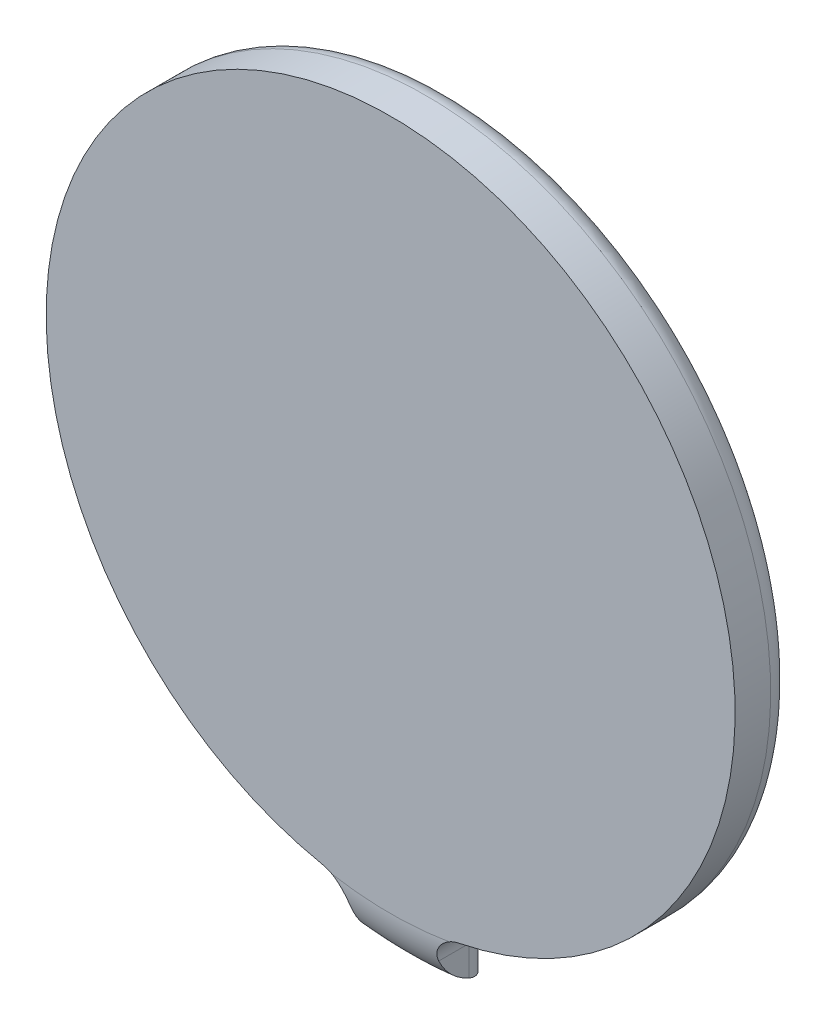
ISO-10303-21;
HEADER;
FILE_DESCRIPTION(('STEP AP214'),'2;1');
FILE_NAME('part.step','',(''),(''),'','','');
FILE_SCHEMA(('AUTOMOTIVE_DESIGN { 1 0 10303 214 1 1 1 1 }'));
ENDSEC;
DATA;
#1=APPLICATION_CONTEXT('core data for automotive mechanical design processes');
#2=APPLICATION_PROTOCOL_DEFINITION('international standard','automotive_design',2000,#1);
#3=PRODUCT_CONTEXT('',#1,'mechanical');
#4=PRODUCT('Part','Part','',(#3));
#5=PRODUCT_RELATED_PRODUCT_CATEGORY('part','',(#4));
#6=PRODUCT_DEFINITION_FORMATION('','',#4);
#7=PRODUCT_DEFINITION_CONTEXT('part definition',#1,'design');
#8=PRODUCT_DEFINITION('design','',#6,#7);
#9=PRODUCT_DEFINITION_SHAPE('','',#8);
#10=(LENGTH_UNIT() NAMED_UNIT(*) SI_UNIT(.MILLI.,.METRE.));
#11=(NAMED_UNIT(*) PLANE_ANGLE_UNIT() SI_UNIT($,.RADIAN.));
#12=(NAMED_UNIT(*) SI_UNIT($,.STERADIAN.) SOLID_ANGLE_UNIT());
#13=UNCERTAINTY_MEASURE_WITH_UNIT(LENGTH_MEASURE(1.E-05),#10,'distance_accuracy_value','');
#14=(GEOMETRIC_REPRESENTATION_CONTEXT(3) GLOBAL_UNCERTAINTY_ASSIGNED_CONTEXT((#13)) GLOBAL_UNIT_ASSIGNED_CONTEXT((#10,
#11,#12)) REPRESENTATION_CONTEXT('',''));
#15=CARTESIAN_POINT('',(0.,0.,0.));
#16=DIRECTION('',(0.,0.,1.));
#17=DIRECTION('',(1.,0.,0.));
#18=AXIS2_PLACEMENT_3D('',#15,#16,#17);
#19=CARTESIAN_POINT('',(1.06401134813455E-06,-1.62435410016243E-06,10.));
#20=DIRECTION('',(0.,0.,1.));
#21=DIRECTION('',(1.,0.,0.));
#22=AXIS2_PLACEMENT_3D('',#19,#20,#21);
#23=TOROIDAL_SURFACE('',#22,29.1827189766862,5.);
#24=CARTESIAN_POINT('',(5.72743974380435,-28.4621733237524,14.9977494937793));
#25=CARTESIAN_POINT('',(5.65452435426167,-28.476832506908,14.9977343908321));
#26=CARTESIAN_POINT('',(5.58223279373518,-28.4945743568944,14.9978512994538));
#27=CARTESIAN_POINT('',(5.43939919044139,-28.5360665243763,14.9982404246621));
#28=CARTESIAN_POINT('',(5.36885706045361,-28.5598165416617,14.9985126334895));
#29=CARTESIAN_POINT('',(5.23001285180405,-28.6131711879578,14.999103680927));
#30=CARTESIAN_POINT('',(5.16171090054791,-28.6427761492857,14.9994225221836));
#31=CARTESIAN_POINT('',(5.02785386968332,-28.7076103965319,14.9998943223226));
#32=CARTESIAN_POINT('',(4.96229876753665,-28.7428396362908,15.0000472825664));
#33=CARTESIAN_POINT('',(4.77037015301277,-28.8566710839978,14.999862806468));
#34=CARTESIAN_POINT('',(4.64869821550994,-28.9434305495226,14.9988824112752));
#35=CARTESIAN_POINT('',(4.421799447602,-29.1359952347135,14.9923773460635));
#36=CARTESIAN_POINT('',(4.31656504344077,-29.2417916342791,14.9868547762896));
#37=CARTESIAN_POINT('',(4.12678397197212,-29.4676859938194,14.9681018522867));
#38=CARTESIAN_POINT('',(4.04198763000879,-29.5875815596131,14.954971985052));
#39=CARTESIAN_POINT('',(3.89386807585266,-29.8385251158249,14.9181024425804));
#40=CARTESIAN_POINT('',(3.83054107791195,-29.9695711349499,14.8943646395828));
#41=CARTESIAN_POINT('',(3.72947979284891,-30.230646370297,14.8357404877748));
#42=CARTESIAN_POINT('',(3.69058644208153,-30.3603744574925,14.8014976770671));
#43=CARTESIAN_POINT('',(3.63334761322277,-30.6204668965051,14.72086074036));
#44=CARTESIAN_POINT('',(3.61497588473438,-30.7508302207487,14.6744822318345));
#45=CARTESIAN_POINT('',(3.60409760440967,-30.9096902680771,14.6099349669589));
#46=CARTESIAN_POINT('',(3.6025512595801,-30.9400228233211,14.5972400625739));
#47=CARTESIAN_POINT('',(3.60050369041556,-31.0003939565906,14.5712285266485));
#48=CARTESIAN_POINT('',(3.6000006710224,-31.0304329508905,14.5579130033318));
#49=CARTESIAN_POINT('',(3.60000107155852,-31.0603397720777,14.5442803381412));
#50=B_SPLINE_CURVE_WITH_KNOTS('',3,(#24,#25,#26,#27,#28,#29,#30,#31,#32,#33,#34,#35,#36,#37,#38,
#39,#40,#41,#42,#43,#44,#45,#46,#47,#48,#49),.UNSPECIFIED.,.F.,.F.,(4,2,2,2,2,2,2,2,2,2,2,2,4),
(0.,0.223050177425914,0.446089211904487,0.669140909358109,0.892190776287068,1.3381790248071,
1.78396116977377,2.22398491351687,2.66393102626924,3.08101200225106,3.49755885262959,
3.59630235013565,3.69487581646236),.UNSPECIFIED.);
#51=CARTESIAN_POINT('',(4.9275565203281,-28.7636989544465,15.));
#52=VERTEX_POINT('',#51);
#53=CARTESIAN_POINT('',(3.60000106401135,-31.0601397720777,14.5443715107841));
#54=VERTEX_POINT('',#53);
#55=EDGE_CURVE('E11',#52,#54,#50,.T.);
#56=ORIENTED_EDGE('',*,*,#55,.F.);
#57=CARTESIAN_POINT('',(1.06401134813455E-06,-1.62435410016243E-06,15.));
#58=DIRECTION('',(0.,0.,-1.));
#59=DIRECTION('',(-1.,0.,0.));
#60=AXIS2_PLACEMENT_3D('',#57,#58,#59);
#61=CIRCLE('',#60,29.1827189766862);
#62=CARTESIAN_POINT('',(-4.92755439230549,-28.7636989544465,15.));
#63=VERTEX_POINT('',#62);
#64=EDGE_CURVE('E127',#63,#52,#61,.F.);
#65=ORIENTED_EDGE('',*,*,#64,.F.);
#66=CARTESIAN_POINT('',(-3.59999894353582,-31.0603397720777,14.5442803381412));
#67=CARTESIAN_POINT('',(-3.59998444575881,-30.9968757878363,14.5732264098584));
#68=CARTESIAN_POINT('',(-3.60226940213302,-30.9327456586411,14.6007395356784));
#69=CARTESIAN_POINT('',(-3.61165085625501,-30.8036283489733,14.6528262252884));
#70=CARTESIAN_POINT('',(-3.61874881998883,-30.7386409132904,14.6773988907647));
#71=CARTESIAN_POINT('',(-3.63795757717695,-30.6084022387194,14.7234853896591));
#72=CARTESIAN_POINT('',(-3.65006230351932,-30.5431514134444,14.7450028830371));
#73=CARTESIAN_POINT('',(-3.67938708601792,-30.412899463917,14.785004172535));
#74=CARTESIAN_POINT('',(-3.69660640922361,-30.3478983052371,14.8034884027497));
#75=CARTESIAN_POINT('',(-3.75614050096227,-30.1538034672386,14.8545417443241));
#76=CARTESIAN_POINT('',(-3.80630306171519,-30.0258177602998,14.8826423357786));
#77=CARTESIAN_POINT('',(-3.92678491854651,-29.7778759234524,14.9281326102914));
#78=CARTESIAN_POINT('',(-3.99709282027738,-29.6579153016762,14.9455283306427));
#79=CARTESIAN_POINT('',(-4.15482629214307,-29.4318170272014,14.9717024228866));
#80=CARTESIAN_POINT('',(-4.24194797217504,-29.325482786106,14.9806191991187));
#81=CARTESIAN_POINT('',(-4.43184464078187,-29.1273516873463,14.9928872813536));
#82=CARTESIAN_POINT('',(-4.53463347004701,-29.0355678315183,14.9962336348558));
#83=CARTESIAN_POINT('',(-4.75872608553547,-28.8648160219328,14.9999569246587));
#84=CARTESIAN_POINT('',(-4.8807023285835,-28.7867282270911,15.0001755384882));
#85=CARTESIAN_POINT('',(-5.13563990940408,-28.6515159905706,14.9996421110835));
#86=CARTESIAN_POINT('',(-5.26858663106621,-28.594364190951,14.998891342432));
#87=CARTESIAN_POINT('',(-5.4579339476624,-28.5306634660948,14.9981876629065));
#88=CARTESIAN_POINT('',(-5.51126989704546,-28.5145776489435,14.9980278236432));
#89=CARTESIAN_POINT('',(-5.61876156305673,-28.4858198594248,14.9978076775179));
#90=CARTESIAN_POINT('',(-5.67291580388548,-28.4731423724336,14.9977472090551));
#91=CARTESIAN_POINT('',(-5.72743761578164,-28.4621733237524,14.9977494937793));
#92=B_SPLINE_CURVE_WITH_KNOTS('',3,(#66,#67,#68,#69,#70,#71,#72,#73,#74,#75,#76,#77,#78,#79,#80,
#81,#82,#83,#84,#85,#86,#87,#88,#89,#90,#91),.UNSPECIFIED.,.F.,.F.,(4,2,2,2,2,2,2,2,2,2,2,2,4),
(0.,0.209220863902826,0.418505482688915,0.627537233404117,0.836539043133054,1.25517288319699,
1.67357040682714,2.08501472931735,2.4968246599702,2.92941018071078,3.36142839019847,
3.52846877003367,3.69523723207078),.UNSPECIFIED.);
#93=CARTESIAN_POINT('',(-3.59999893598865,-31.0601397720777,14.5443715107841));
#94=VERTEX_POINT('',#93);
#95=EDGE_CURVE('E229',#94,#63,#92,.T.);
#96=ORIENTED_EDGE('',*,*,#95,.F.);
#97=CARTESIAN_POINT('',(-3.59999893598865,-26.7297537445027,14.484271778565));
#98=CARTESIAN_POINT('',(-3.59999893598865,-26.858056578042,14.5470002655548));
#99=CARTESIAN_POINT('',(-3.59999893598865,-26.9890188619382,14.6042806064454));
#100=CARTESIAN_POINT('',(-3.59999893598865,-27.2552951529068,14.7076063401975));
#101=CARTESIAN_POINT('',(-3.59999893598865,-27.3906089211916,14.753652348356));
#102=CARTESIAN_POINT('',(-3.59999893598865,-27.664549527534,14.8341525105312));
#103=CARTESIAN_POINT('',(-3.59999893598865,-27.8031742392639,14.8686139007514));
#104=CARTESIAN_POINT('',(-3.59999893598865,-28.0828307240921,14.9257476123564));
#105=CARTESIAN_POINT('',(-3.59999893598865,-28.2238624755718,14.9484200395654));
#106=CARTESIAN_POINT('',(-3.59999893598865,-28.5073699338428,14.9818177440214));
#107=CARTESIAN_POINT('',(-3.59999893598865,-28.6498459975083,14.9925399921287));
#108=CARTESIAN_POINT('',(-3.59999893598865,-28.935247886346,15.0019480734467));
#109=CARTESIAN_POINT('',(-3.59999893598865,-29.0781738581738,15.000629460498));
#110=CARTESIAN_POINT('',(-3.59999893598865,-29.3633245976379,14.9859501298111));
#111=CARTESIAN_POINT('',(-3.59999893598865,-29.5055497183478,14.9725962725611));
#112=CARTESIAN_POINT('',(-3.59999893598865,-29.7884192554774,14.9339322467623));
#113=CARTESIAN_POINT('',(-3.59999893598865,-29.9290630704984,14.9086176769889));
#114=CARTESIAN_POINT('',(-3.59999893598865,-30.2075774920563,14.846226722682));
#115=CARTESIAN_POINT('',(-3.59999893598865,-30.3454506005594,14.8091615080922));
#116=CARTESIAN_POINT('',(-3.59999893598865,-30.6176218192334,14.7234949575996));
#117=CARTESIAN_POINT('',(-3.59999893598865,-30.751918586623,14.6748893547848));
#118=CARTESIAN_POINT('',(-3.59999893598865,-31.0158838240633,14.5664935035577));
#119=CARTESIAN_POINT('',(-3.59999893598865,-31.1455533615922,14.5067058549106));
#120=CARTESIAN_POINT('',(-3.59999893598865,-31.3994032886358,14.3763268136733));
#121=CARTESIAN_POINT('',(-3.59999893598865,-31.5235816487335,14.3057314691046));
#122=CARTESIAN_POINT('',(-3.59999893598865,-31.7648618725127,14.1546402619869));
#123=CARTESIAN_POINT('',(-3.59999893598865,-31.8819972046623,14.0741978433725));
#124=CARTESIAN_POINT('',(-3.59999893598865,-32.109077503824,13.903655356653));
#125=CARTESIAN_POINT('',(-3.59999893598865,-32.2190199580159,13.8135519421974));
#126=CARTESIAN_POINT('',(-3.59999893598865,-32.4308385483615,13.6243687118066));
#127=CARTESIAN_POINT('',(-3.59999893598865,-32.5327167803282,13.5252912425894));
#128=CARTESIAN_POINT('',(-3.59999893598865,-32.7276902056947,13.3188418121353));
#129=CARTESIAN_POINT('',(-3.59999893598865,-32.8207854618144,13.2114699101393));
#130=CARTESIAN_POINT('',(-3.59999893598865,-32.9969652852379,12.989877631646));
#131=CARTESIAN_POINT('',(-3.59999893598865,-33.0801076319578,12.8757031901242));
#132=CARTESIAN_POINT('',(-3.59999893598865,-33.2364018747024,12.6407678680944));
#133=CARTESIAN_POINT('',(-3.59999893598865,-33.3095573318449,12.5200093569365));
#134=CARTESIAN_POINT('',(-3.59999893598865,-33.4453977853892,12.2726872773932));
#135=CARTESIAN_POINT('',(-3.59999893598865,-33.508079272309,12.1461217813114));
#136=CARTESIAN_POINT('',(-3.59999893598865,-33.6224579961781,11.888177501119));
#137=CARTESIAN_POINT('',(-3.59999893598865,-33.6741593449555,11.7568005404848));
#138=CARTESIAN_POINT('',(-3.59999893598865,-33.7659839871463,11.4908304265516));
#139=CARTESIAN_POINT('',(-3.59999893598865,-33.8061664277625,11.3562576908728));
#140=CARTESIAN_POINT('',(-3.59999893598865,-33.8750048518474,11.0842492241896));
#141=CARTESIAN_POINT('',(-3.59999893598865,-33.9036651609708,10.9468145880232));
#142=CARTESIAN_POINT('',(-3.59999893598865,-33.9492829282875,10.6699379128685));
#143=CARTESIAN_POINT('',(-3.59999893598865,-33.9662338659375,10.5304947994762));
#144=CARTESIAN_POINT('',(-3.59999893598865,-33.988278186477,10.2507264679218));
#145=CARTESIAN_POINT('',(-3.59999893598865,-33.9933759739013,10.1104015968558));
#146=CARTESIAN_POINT('',(-3.59999893598865,-33.9916914004408,9.83014778004418));
#147=CARTESIAN_POINT('',(-3.59999893598865,-33.9849364575298,9.690218668542));
#148=CARTESIAN_POINT('',(-3.59999893598865,-33.959653451819,9.41148052896702));
#149=CARTESIAN_POINT('',(-3.59999893598865,-33.9411297921343,9.27267110163992));
#150=CARTESIAN_POINT('',(-3.59999893598865,-33.8924677136672,8.99721163091675));
#151=CARTESIAN_POINT('',(-3.59999893598865,-33.8623379617628,8.86056005521836));
#152=CARTESIAN_POINT('',(-3.59999893598865,-33.7906952557413,8.59032784979729));
#153=CARTESIAN_POINT('',(-3.59999893598865,-33.7491868891583,8.45674600592003));
#154=CARTESIAN_POINT('',(-3.59999893598865,-33.6618656404782,8.21251191611961));
#155=CARTESIAN_POINT('',(-3.59999893598865,-33.6175331542934,8.10132759698105));
#156=CARTESIAN_POINT('',(-3.59999893598865,-33.5210802434081,7.88263529739623));
#157=CARTESIAN_POINT('',(-3.59999893598865,-33.4689743480039,7.77512090861954));
#158=CARTESIAN_POINT('',(-3.59999893598865,-33.4130643147077,7.66961397242508));
#159=B_SPLINE_CURVE_WITH_KNOTS('',3,(#97,#98,#99,#100,#101,#102,#103,#104,#105,#106,#107,#108,
#109,#110,#111,#112,#113,#114,#115,#116,#117,#118,#119,#120,#121,#122,#123,#124,#125,#126,#127,
#128,#129,#130,#131,#132,#133,#134,#135,#136,#137,#138,#139,#140,#141,#142,#143,#144,#145,#146,
#147,#148,#149,#150,#151,#152,#153,#154,#155,#156,#157,#158),.UNSPECIFIED.,.F.,.F.,(4,2,2,2,2,2,
2,2,2,2,2,2,2,2,2,2,2,2,2,2,2,2,2,2,2,2,2,2,2,2,4),(0.,0.428316284423876,0.856609104976208,
1.28463389787311,1.71265484852257,2.14078426956561,2.56907178632896,2.99711531931891,
3.42531648377317,3.85311182255659,4.28106558022587,4.70891996436122,5.13693117450988,
5.56271461980184,5.98864602622321,6.41446637126177,6.8402836752578,7.26349493763252,
7.68655489525423,8.10975632329295,8.53279899085442,8.95362883269052,9.37430053813265,
9.79520631263565,10.2159556569426,10.6357329981037,11.0553533773449,11.4746610095972,
11.8937998369305,12.2525871023709,12.6107119702999),.UNSPECIFIED.);
#160=CARTESIAN_POINT('',(-3.59999893598865,-33.5728347526865,12.));
#161=VERTEX_POINT('',#160);
#162=EDGE_CURVE('E71',#94,#161,#159,.T.);
#163=ORIENTED_EDGE('',*,*,#162,.T.);
#164=CARTESIAN_POINT('',(-3.59999892517784,-33.5727469610749,12.0002));
#165=CARTESIAN_POINT('',(-3.60000343776951,-33.594810556376,11.9499469267284));
#166=CARTESIAN_POINT('',(-3.59796028149307,-33.6162142676411,11.8994231909293));
#167=CARTESIAN_POINT('',(-3.58965599463252,-33.6576389100815,11.7981358889826));
#168=CARTESIAN_POINT('',(-3.58339331138171,-33.6776593292532,11.7473722413846));
#169=CARTESIAN_POINT('',(-3.55809170310904,-33.7355327907448,11.595215762932));
#170=CARTESIAN_POINT('',(-3.53253914959309,-33.7711917974325,11.49397169711));
#171=CARTESIAN_POINT('',(-3.46375504790968,-33.8363395943015,11.2952797209983));
#172=CARTESIAN_POINT('',(-3.42047723205476,-33.8658119287619,11.1978424822308));
#173=CARTESIAN_POINT('',(-3.31693852453738,-33.9186763525395,11.01075430238));
#174=CARTESIAN_POINT('',(-3.25669720660372,-33.9420753902187,10.921094542132));
#175=CARTESIAN_POINT('',(-3.12388425524803,-33.9825725973063,10.7567810861264));
#176=CARTESIAN_POINT('',(-3.05199911630376,-33.9999091900684,10.6816299442485));
#177=CARTESIAN_POINT('',(-2.89612182975859,-34.0305930720853,10.5440785402961));
#178=CARTESIAN_POINT('',(-2.81212465794194,-34.0439386987429,10.4816835957422));
#179=CARTESIAN_POINT('',(-2.6356775633925,-34.0674322344621,10.3725160540753));
#180=CARTESIAN_POINT('',(-2.54335161620754,-34.0776194300995,10.3255510503791));
#181=CARTESIAN_POINT('',(-2.35200754679306,-34.0958447377431,10.2476476880483));
#182=CARTESIAN_POINT('',(-2.25299404797024,-34.1038843158216,10.2166983826913));
#183=CARTESIAN_POINT('',(-2.08610819900358,-34.1158612293779,10.1795297734889));
#184=CARTESIAN_POINT('',(-2.01930830369566,-34.1202557172303,10.1684595675214));
#185=CARTESIAN_POINT('',(-1.88495287785334,-34.1284117785465,10.1536917176034));
#186=CARTESIAN_POINT('',(-1.81739849825113,-34.1321742044572,10.1499840696752));
#187=CARTESIAN_POINT('',(-1.74979893598865,-34.135651973816,10.1500000108108));
#188=B_SPLINE_CURVE_WITH_KNOTS('',3,(#164,#165,#166,#167,#168,#169,#170,#171,#172,#173,#174,
#175,#176,#177,#178,#179,#180,#181,#182,#183,#184,#185,#186,#187),.UNSPECIFIED.,.F.,.F.,(4,2,2,
2,2,2,2,2,2,2,2,4),(0.,0.164566657297011,0.329193903570246,0.658494637989713,0.988660470025734,
1.31844688277812,1.63321411991334,1.94811230388487,2.25891994202214,2.56951486175687,
2.77269554814567,2.97559997054066),.UNSPECIFIED.);
#189=CARTESIAN_POINT('',(-1.74999893598875,-34.135641721515,10.15));
#190=VERTEX_POINT('',#189);
#191=EDGE_CURVE('E190',#161,#190,#188,.T.);
#192=ORIENTED_EDGE('',*,*,#191,.T.);
#193=CARTESIAN_POINT('',(1.06401134813455E-06,-1.62435410016243E-06,10.15));
#194=DIRECTION('',(0.,0.,1.));
#195=DIRECTION('',(1.,0.,0.));
#196=AXIS2_PLACEMENT_3D('',#193,#194,#195);
#197=CIRCLE('',#196,34.1804684702083);
#198=CARTESIAN_POINT('',(1.75000106401135,-34.135641721515,10.15));
#199=VERTEX_POINT('',#198);
#200=EDGE_CURVE('E198',#199,#190,#197,.F.);
#201=ORIENTED_EDGE('',*,*,#200,.F.);
#202=CARTESIAN_POINT('',(1.74980106401135,-34.135651973816,10.1500000108108));
#203=CARTESIAN_POINT('',(1.80180100186951,-34.1329826007672,10.1499946660402));
#204=CARTESIAN_POINT('',(1.85376698347144,-34.1301383065574,10.1521826100539));
#205=CARTESIAN_POINT('',(1.95730712909934,-34.1240845974106,10.1609170359705));
#206=CARTESIAN_POINT('',(2.00888131366615,-34.1208752017578,10.1674632877618));
#207=CARTESIAN_POINT('',(2.16237028843179,-34.1106871715014,10.1935691679029));
#208=CARTESIAN_POINT('',(2.26322449638453,-34.1031400204594,10.2195961103646));
#209=CARTESIAN_POINT('',(2.45900473392788,-34.0860891069732,10.2881036552385));
#210=CARTESIAN_POINT('',(2.5539277884034,-34.0765843726968,10.3305924393143));
#211=CARTESIAN_POINT('',(2.73510122641695,-34.054853674457,10.4306758951634));
#212=CARTESIAN_POINT('',(2.82135306433652,-34.0426281679448,10.4882680278575));
#213=CARTESIAN_POINT('',(2.98260330811467,-34.0145551736584,10.6165990130429));
#214=CARTESIAN_POINT('',(3.05761481694959,-33.9987119583516,10.6873223394965));
#215=CARTESIAN_POINT('',(3.19441658028764,-33.9625050920314,10.839555160019));
#216=CARTESIAN_POINT('',(3.25620879737151,-33.9421421129533,10.9210630500631));
#217=CARTESIAN_POINT('',(3.36492754992057,-33.8962630092515,11.0918483202126));
#218=CARTESIAN_POINT('',(3.41188774190937,-33.8707587698682,11.1811075152805));
#219=CARTESIAN_POINT('',(3.49031752403112,-33.8142108702012,11.3645837801946));
#220=CARTESIAN_POINT('',(3.52178136102028,-33.7831651584213,11.4588026770216));
#221=CARTESIAN_POINT('',(3.56384456564172,-33.7230876968187,11.6280898520647));
#222=CARTESIAN_POINT('',(3.5775153249557,-33.6951222478363,11.7027981127294));
#223=CARTESIAN_POINT('',(3.5955991466468,-33.6361616617195,11.851954027532));
#224=CARTESIAN_POINT('',(3.60003246293241,-33.6051733091906,11.9264018937613));
#225=CARTESIAN_POINT('',(3.60000105320054,-33.5727469610749,12.0002));
#226=B_SPLINE_CURVE_WITH_KNOTS('',3,(#202,#203,#204,#205,#206,#207,#208,#209,#210,#211,#212,
#213,#214,#215,#216,#217,#218,#219,#220,#221,#222,#223,#224,#225),.UNSPECIFIED.,.F.,.F.,(4,2,2,
2,2,2,2,2,2,2,2,4),(0.,0.156108835053689,0.312209428470979,0.623897587638134,0.935740857384795,
1.24753173558833,1.55895627996233,1.87033455706001,2.18100109838381,2.49178289032828,
2.734012572694,2.97571058382496),.UNSPECIFIED.);
#227=CARTESIAN_POINT('',(3.60000106401135,-33.572834752686,12.));
#228=VERTEX_POINT('',#227);
#229=EDGE_CURVE('E230',#199,#228,#226,.T.);
#230=ORIENTED_EDGE('',*,*,#229,.T.);
#231=CARTESIAN_POINT('',(3.60000106401135,-33.4130643147077,7.66961397242508));
#232=CARTESIAN_POINT('',(3.60000106401135,-33.4786159100993,7.79330022250026));
#233=CARTESIAN_POINT('',(3.60000106401135,-33.538933711099,7.91975822532707));
#234=CARTESIAN_POINT('',(3.60000106401135,-33.6487227356979,8.17729315146078));
#235=CARTESIAN_POINT('',(3.60000106401135,-33.6981943344999,8.30836991480867));
#236=CARTESIAN_POINT('',(3.60000106401135,-33.785887236908,8.57413761207249));
#237=CARTESIAN_POINT('',(3.60000106401135,-33.8241160382513,8.70882607166908));
#238=CARTESIAN_POINT('',(3.60000106401135,-33.8890926191764,8.98094212782075));
#239=CARTESIAN_POINT('',(3.60000106401135,-33.9158405862842,9.11836967959759));
#240=CARTESIAN_POINT('',(3.60000106401135,-33.9576670773804,9.39503908645444));
#241=CARTESIAN_POINT('',(3.60000106401135,-33.9727414804994,9.53428156459771));
#242=CARTESIAN_POINT('',(3.60000106401135,-33.9910985163536,9.81359343932889));
#243=CARTESIAN_POINT('',(3.60000106401135,-33.9943767882829,9.95366312255593));
#244=CARTESIAN_POINT('',(3.60000106401135,-33.9891069015881,10.2334966618944));
#245=CARTESIAN_POINT('',(3.60000106401135,-33.9805657508671,10.3732606500584));
#246=CARTESIAN_POINT('',(3.60000106401135,-33.9517266961259,10.6516225484683));
#247=CARTESIAN_POINT('',(3.60000106401135,-33.9314244546208,10.7902200093572));
#248=CARTESIAN_POINT('',(3.60000106401135,-33.8792436708348,11.0650249971792));
#249=CARTESIAN_POINT('',(3.60000106401135,-33.8473807197684,11.2012354851349));
#250=CARTESIAN_POINT('',(3.60000106401135,-33.7722930885111,11.4705419652363));
#251=CARTESIAN_POINT('',(3.60000106401135,-33.7290642262964,11.6036367913205));
#252=CARTESIAN_POINT('',(3.60000106401135,-33.6315750917467,11.865691583157));
#253=CARTESIAN_POINT('',(3.60000106401135,-33.5773170855925,11.9946523920425));
#254=CARTESIAN_POINT('',(3.60000106401135,-33.4581361136978,12.2476057930624));
#255=CARTESIAN_POINT('',(3.60000106401135,-33.3932092215282,12.3715965351056));
#256=CARTESIAN_POINT('',(3.60000106401135,-33.253089053139,12.613836937917));
#257=CARTESIAN_POINT('',(3.60000106401135,-33.1778833152095,12.7320793900711));
#258=CARTESIAN_POINT('',(3.60000106401135,-33.017782343781,12.9618722094055));
#259=CARTESIAN_POINT('',(3.60000106401135,-32.9328837530557,13.0734202373644));
#260=CARTESIAN_POINT('',(3.60000106401135,-32.7540507273869,13.2889770778462));
#261=CARTESIAN_POINT('',(3.60000106401135,-32.6601183920116,13.3929876323764));
#262=CARTESIAN_POINT('',(3.60000106401135,-32.4638743777573,13.5927784228708));
#263=CARTESIAN_POINT('',(3.60000106401135,-32.3615626476288,13.6885586084896));
#264=CARTESIAN_POINT('',(3.60000106401135,-32.1487992302908,13.8716518810015));
#265=CARTESIAN_POINT('',(3.60000106401135,-32.0383121232525,13.9589238094147));
#266=CARTESIAN_POINT('',(3.60000106401135,-31.8104479412501,14.1238669005287));
#267=CARTESIAN_POINT('',(3.60000106401135,-31.6930732085621,14.2015412994747));
#268=CARTESIAN_POINT('',(3.60000106401135,-31.4521898840645,14.3468212889718));
#269=CARTESIAN_POINT('',(3.60000106401135,-31.3286790069714,14.4144230901297));
#270=CARTESIAN_POINT('',(3.60000106401135,-31.0764846704584,14.5390432502161));
#271=CARTESIAN_POINT('',(3.60000106401135,-30.9478030797361,14.5960653915224));
#272=CARTESIAN_POINT('',(3.60000106401135,-30.6852947343885,14.6995044569607));
#273=CARTESIAN_POINT('',(3.60000106401135,-30.5514403580554,14.7458512904398));
#274=CARTESIAN_POINT('',(3.60000106401135,-30.2803666131164,14.8271447582164));
#275=CARTESIAN_POINT('',(3.60000106401135,-30.1431484690774,14.8620954768583));
#276=CARTESIAN_POINT('',(3.60000106401135,-29.8661895174971,14.920406083004));
#277=CARTESIAN_POINT('',(3.60000106401135,-29.7264473147435,14.9437593431554));
#278=CARTESIAN_POINT('',(3.60000106401135,-29.4455506310585,14.9786884476889));
#279=CARTESIAN_POINT('',(3.60000106401135,-29.3043966785672,14.9902685437549));
#280=CARTESIAN_POINT('',(3.60000106401135,-29.0206628039562,15.0016341915146));
#281=CARTESIAN_POINT('',(3.60000106401135,-28.8780796774418,15.001339863909));
#282=CARTESIAN_POINT('',(3.60000106401135,-28.593494714976,14.9887710287496));
#283=CARTESIAN_POINT('',(3.60000106401135,-28.4514926864628,14.9765008786055));
#284=CARTESIAN_POINT('',(3.60000106401135,-28.1691123978818,14.9400896483309));
#285=CARTESIAN_POINT('',(3.60000106401135,-28.0287331513304,14.9159562154469));
#286=CARTESIAN_POINT('',(3.60000106401135,-27.7505451227974,14.8560035912029));
#287=CARTESIAN_POINT('',(3.60000106401135,-27.6127354024474,14.8201887577927));
#288=CARTESIAN_POINT('',(3.60000106401135,-27.3484462123517,14.7395097977228));
#289=CARTESIAN_POINT('',(3.60000106401135,-27.2217711100911,14.6952850687691));
#290=CARTESIAN_POINT('',(3.60000106401135,-26.9725429910945,14.5970460249746));
#291=CARTESIAN_POINT('',(3.60000106401135,-26.8499828787062,14.5430497091593));
#292=CARTESIAN_POINT('',(3.60000106401135,-26.7297537445027,14.484271778565));
#293=B_SPLINE_CURVE_WITH_KNOTS('',3,(#231,#232,#233,#234,#235,#236,#237,#238,#239,#240,#241,
#242,#243,#244,#245,#246,#247,#248,#249,#250,#251,#252,#253,#254,#255,#256,#257,#258,#259,#260,
#261,#262,#263,#264,#265,#266,#267,#268,#269,#270,#271,#272,#273,#274,#275,#276,#277,#278,#279,
#280,#281,#282,#283,#284,#285,#286,#287,#288,#289,#290,#291,#292),.UNSPECIFIED.,.F.,.F.,(4,2,2,
2,2,2,2,2,2,2,2,2,2,2,2,2,2,2,2,2,2,2,2,2,2,2,2,2,2,2,4),(0.,0.419823427949583,
0.839632330646015,1.25916062774716,1.67868207208127,2.09835154370198,2.5181761432323,
2.93775192943352,3.35748255359246,3.77664920437295,4.19597030154993,4.61520532689206,
5.03459498866645,5.45449768993926,5.8745462729002,6.29449746556403,6.71445122690287,
7.13634500007647,7.55809612200586,7.9800055116762,8.40176377089699,8.82621687864699,
9.25051769562651,9.67506070054192,10.0994503342411,10.5266953118305,10.9537848940258,
11.3805995283084,11.8072551137409,12.2093569273638,12.6107254815907),.UNSPECIFIED.);
#294=EDGE_CURVE('E56',#228,#54,#293,.T.);
#295=ORIENTED_EDGE('',*,*,#294,.T.);
#296=EDGE_LOOP('',(#56,#65,#96,#163,#192,#201,#230,#295));
#297=FACE_BOUND('',#296,.T.);
#298=ADVANCED_FACE('F43',(#297),#23,.T.);
#299=CARTESIAN_POINT('',(0.,0.,15.));
#300=DIRECTION('',(0.,0.,-1.));
#301=DIRECTION('',(-1.,0.,0.));
#302=AXIS2_PLACEMENT_3D('',#299,#300,#301);
#303=PLANE('',#302);
#304=CARTESIAN_POINT('',(1.06401134813455E-06,-1.62435410016243E-06,15.));
#305=DIRECTION('',(0.,0.,1.));
#306=DIRECTION('',(1.,0.,0.));
#307=AXIS2_PLACEMENT_3D('',#304,#305,#306);
#308=CIRCLE('',#307,29.0327189766862);
#309=CARTESIAN_POINT('',(5.72723974380433,-28.4622135602511,15.));
#310=VERTEX_POINT('',#309);
#311=CARTESIAN_POINT('',(-5.72723761578164,-28.4622135602511,15.));
#312=VERTEX_POINT('',#311);
#313=EDGE_CURVE('E160',#310,#312,#308,.T.);
#314=ORIENTED_EDGE('',*,*,#313,.T.);
#315=CARTESIAN_POINT('',(-6.24999893598865,-31.0601397720777,15.));
#316=DIRECTION('',(0.,0.,1.));
#317=DIRECTION('',(1.,0.,0.));
#318=AXIS2_PLACEMENT_3D('',#315,#316,#317);
#319=CIRCLE('',#318,2.65);
#320=EDGE_CURVE('E184',#63,#312,#319,.T.);
#321=ORIENTED_EDGE('',*,*,#320,.F.);
#322=ORIENTED_EDGE('',*,*,#64,.T.);
#323=CARTESIAN_POINT('',(6.25000106401135,-31.0601397720777,15.));
#324=DIRECTION('',(0.,0.,1.));
#325=DIRECTION('',(1.,0.,0.));
#326=AXIS2_PLACEMENT_3D('',#323,#324,#325);
#327=CIRCLE('',#326,2.65);
#328=EDGE_CURVE('E139',#310,#52,#327,.T.);
#329=ORIENTED_EDGE('',*,*,#328,.F.);
#330=EDGE_LOOP('',(#314,#321,#322,#329));
#331=FACE_BOUND('',#330,.T.);
#332=ADVANCED_FACE('F206',(#331),#303,.F.);
#333=CARTESIAN_POINT('',(1.06401134813455E-06,-1.62435410016243E-06,12.));
#334=DIRECTION('',(0.,0.,1.));
#335=DIRECTION('',(1.,0.,0.));
#336=AXIS2_PLACEMENT_3D('',#333,#334,#335);
#337=TOROIDAL_SURFACE('',#336,27.1827189766862,1.85);
#338=CARTESIAN_POINT('',(5.36229316177302,-26.648566959542,12.));
#339=DIRECTION('',(-0.98034951389681,-0.197268422719624,0.));
#340=DIRECTION('',(0.197268422719624,-0.98034951389681,0.));
#341=AXIS2_PLACEMENT_3D('',#338,#339,#340);
#342=CIRCLE('',#341,1.85);
#343=CARTESIAN_POINT('',(5.72723974380435,-28.4622135602511,12.));
#344=VERTEX_POINT('',#343);
#345=CARTESIAN_POINT('',(5.36229316177304,-26.648566959542,10.15));
#346=VERTEX_POINT('',#345);
#347=EDGE_CURVE('E140',#344,#346,#342,.F.);
#348=ORIENTED_EDGE('',*,*,#347,.T.);
#349=CARTESIAN_POINT('',(1.06401134813455E-06,-1.62435410016243E-06,10.15));
#350=DIRECTION('',(0.,0.,1.));
#351=DIRECTION('',(1.,0.,0.));
#352=AXIS2_PLACEMENT_3D('',#349,#350,#351);
#353=CIRCLE('',#352,27.1827189766862);
#354=CARTESIAN_POINT('',(-5.36229103375034,-26.648566959542,10.15));
#355=VERTEX_POINT('',#354);
#356=EDGE_CURVE('E170',#355,#346,#353,.F.);
#357=ORIENTED_EDGE('',*,*,#356,.F.);
#358=CARTESIAN_POINT('',(-5.36229103375034,-26.648566959542,12.));
#359=DIRECTION('',(0.98034951389681,-0.197268422719625,0.));
#360=DIRECTION('',(0.197268422719625,0.98034951389681,0.));
#361=AXIS2_PLACEMENT_3D('',#358,#359,#360);
#362=CIRCLE('',#361,1.85);
#363=CARTESIAN_POINT('',(-5.72723761578164,-28.4622135602511,12.));
#364=VERTEX_POINT('',#363);
#365=EDGE_CURVE('E169',#364,#355,#362,.T.);
#366=ORIENTED_EDGE('',*,*,#365,.F.);
#367=CARTESIAN_POINT('',(1.06401134813455E-06,-1.62435410016243E-06,12.));
#368=DIRECTION('',(0.,0.,1.));
#369=DIRECTION('',(1.,0.,0.));
#370=AXIS2_PLACEMENT_3D('',#367,#368,#369);
#371=CIRCLE('',#370,29.0327189766862);
#372=EDGE_CURVE('E146',#344,#364,#371,.T.);
#373=ORIENTED_EDGE('',*,*,#372,.F.);
#374=EDGE_LOOP('',(#348,#357,#366,#373));
#375=FACE_BOUND('',#374,.T.);
#376=ADVANCED_FACE('F208',(#375),#337,.T.);
#377=CARTESIAN_POINT('',(6.25000106401135,-31.0601397720777,12.));
#378=DIRECTION('',(0.,0.,1.));
#379=DIRECTION('',(1.,0.,0.));
#380=AXIS2_PLACEMENT_3D('',#377,#378,#379);
#381=TOROIDAL_SURFACE('',#380,4.5,1.85);
#382=CARTESIAN_POINT('',(1.75000106401135,-31.0601397720777,12.));
#383=DIRECTION('',(0.,1.,0.));
#384=DIRECTION('',(-1.,0.,0.));
#385=AXIS2_PLACEMENT_3D('',#382,#383,#384);
#386=CIRCLE('',#385,1.85);
#387=CARTESIAN_POINT('',(3.60000106401135,-31.0601397720777,12.));
#388=VERTEX_POINT('',#387);
#389=CARTESIAN_POINT('',(1.75000106401135,-31.0601397720777,10.15));
#390=VERTEX_POINT('',#389);
#391=EDGE_CURVE('E131',#388,#390,#386,.T.);
#392=ORIENTED_EDGE('',*,*,#391,.T.);
#393=CARTESIAN_POINT('',(6.25000106401135,-31.0601397720777,10.15));
#394=DIRECTION('',(0.,0.,1.));
#395=DIRECTION('',(1.,0.,0.));
#396=AXIS2_PLACEMENT_3D('',#393,#394,#395);
#397=CIRCLE('',#396,4.5);
#398=EDGE_CURVE('E174',#346,#390,#397,.T.);
#399=ORIENTED_EDGE('',*,*,#398,.F.);
#400=ORIENTED_EDGE('',*,*,#347,.F.);
#401=CARTESIAN_POINT('',(6.25000106401135,-31.0601397720777,12.));
#402=DIRECTION('',(0.,0.,1.));
#403=DIRECTION('',(1.,0.,0.));
#404=AXIS2_PLACEMENT_3D('',#401,#402,#403);
#405=CIRCLE('',#404,2.65);
#406=EDGE_CURVE('E128',#388,#344,#405,.F.);
#407=ORIENTED_EDGE('',*,*,#406,.F.);
#408=EDGE_LOOP('',(#392,#399,#400,#407));
#409=FACE_BOUND('',#408,.T.);
#410=ADVANCED_FACE('F143',(#409),#381,.T.);
#411=CARTESIAN_POINT('',(-6.24999893598865,-31.0601397720777,12.));
#412=DIRECTION('',(0.,0.,1.));
#413=DIRECTION('',(1.,0.,0.));
#414=AXIS2_PLACEMENT_3D('',#411,#412,#413);
#415=TOROIDAL_SURFACE('',#414,4.5,1.85);
#416=ORIENTED_EDGE('',*,*,#365,.T.);
#417=CARTESIAN_POINT('',(-6.24999893598865,-31.0601397720777,10.15));
#418=DIRECTION('',(0.,0.,1.));
#419=DIRECTION('',(1.,0.,0.));
#420=AXIS2_PLACEMENT_3D('',#417,#418,#419);
#421=CIRCLE('',#420,4.5);
#422=CARTESIAN_POINT('',(-1.74999893598865,-31.0601397720777,10.15));
#423=VERTEX_POINT('',#422);
#424=EDGE_CURVE('E173',#423,#355,#421,.T.);
#425=ORIENTED_EDGE('',*,*,#424,.F.);
#426=CARTESIAN_POINT('',(-1.74999893598865,-31.0601397720777,12.));
#427=DIRECTION('',(0.,1.,0.));
#428=DIRECTION('',(-1.,0.,0.));
#429=AXIS2_PLACEMENT_3D('',#426,#427,#428);
#430=CIRCLE('',#429,1.85);
#431=CARTESIAN_POINT('',(-3.59999893598865,-31.0601397720777,12.));
#432=VERTEX_POINT('',#431);
#433=EDGE_CURVE('E176',#432,#423,#430,.F.);
#434=ORIENTED_EDGE('',*,*,#433,.F.);
#435=CARTESIAN_POINT('',(-6.24999893598865,-31.0601397720777,12.));
#436=DIRECTION('',(0.,0.,1.));
#437=DIRECTION('',(1.,0.,0.));
#438=AXIS2_PLACEMENT_3D('',#435,#436,#437);
#439=CIRCLE('',#438,2.65);
#440=EDGE_CURVE('E163',#364,#432,#439,.F.);
#441=ORIENTED_EDGE('',*,*,#440,.F.);
#442=EDGE_LOOP('',(#416,#425,#434,#441));
#443=FACE_BOUND('',#442,.T.);
#444=ADVANCED_FACE('F204',(#443),#415,.T.);
#445=CARTESIAN_POINT('',(6.25000106401135,-31.0601397720777,9.99999999999999));
#446=DIRECTION('',(0.,0.,1.));
#447=DIRECTION('',(1.,0.,0.));
#448=AXIS2_PLACEMENT_3D('',#445,#446,#447);
#449=CYLINDRICAL_SURFACE('',#448,2.65);
#450=ORIENTED_EDGE('',*,*,#55,.T.);
#451=DIRECTION('',(0.,0.,1.));
#452=VECTOR('',#451,1.);
#453=CARTESIAN_POINT('',(3.60000106401135,-31.0601397720777,9.99999999999999));
#454=LINE('',#453,#452);
#455=EDGE_CURVE('E123',#388,#54,#454,.T.);
#456=ORIENTED_EDGE('',*,*,#455,.F.);
#457=ORIENTED_EDGE('',*,*,#406,.T.);
#458=DIRECTION('',(0.,0.,1.));
#459=VECTOR('',#458,1.);
#460=CARTESIAN_POINT('',(5.72723974380433,-28.4622135602511,9.99999999999999));
#461=LINE('',#460,#459);
#462=EDGE_CURVE('E157',#310,#344,#461,.F.);
#463=ORIENTED_EDGE('',*,*,#462,.F.);
#464=ORIENTED_EDGE('',*,*,#328,.T.);
#465=EDGE_LOOP('',(#450,#456,#457,#463,#464));
#466=FACE_BOUND('',#465,.T.);
#467=ADVANCED_FACE('F148',(#466),#449,.F.);
#468=CARTESIAN_POINT('',(-1.74999893598865,-28.9407788577361,12.));
#469=DIRECTION('',(0.,1.,0.));
#470=DIRECTION('',(-1.,0.,0.));
#471=AXIS2_PLACEMENT_3D('',#468,#469,#470);
#472=CYLINDRICAL_SURFACE('',#471,1.85);
#473=DIRECTION('',(0.,-1.,0.));
#474=VECTOR('',#473,1.);
#475=CARTESIAN_POINT('',(-3.59999893598865,-28.9407788577361,12.));
#476=LINE('',#475,#474);
#477=EDGE_CURVE('E150',#432,#161,#476,.T.);
#478=ORIENTED_EDGE('',*,*,#477,.F.);
#479=ORIENTED_EDGE('',*,*,#433,.T.);
#480=DIRECTION('',(0.,1.,0.));
#481=VECTOR('',#480,1.);
#482=CARTESIAN_POINT('',(-1.74999893598865,-1.62435410016243E-06,10.15));
#483=LINE('',#482,#481);
#484=EDGE_CURVE('E63',#190,#423,#483,.T.);
#485=ORIENTED_EDGE('',*,*,#484,.F.);
#486=ORIENTED_EDGE('',*,*,#191,.F.);
#487=EDGE_LOOP('',(#478,#479,#485,#486));
#488=FACE_BOUND('',#487,.T.);
#489=ADVANCED_FACE('F200',(#488),#472,.T.);
#490=CARTESIAN_POINT('',(1.75000106401135,-38.5624821422135,12.));
#491=DIRECTION('',(0.,-1.,0.));
#492=DIRECTION('',(1.,0.,0.));
#493=AXIS2_PLACEMENT_3D('',#490,#491,#492);
#494=CYLINDRICAL_SURFACE('',#493,1.85);
#495=DIRECTION('',(0.,1.,0.));
#496=VECTOR('',#495,1.);
#497=CARTESIAN_POINT('',(1.75000106401135,-1.62435410016243E-06,10.15));
#498=LINE('',#497,#496);
#499=EDGE_CURVE('E135',#390,#199,#498,.F.);
#500=ORIENTED_EDGE('',*,*,#499,.F.);
#501=ORIENTED_EDGE('',*,*,#391,.F.);
#502=DIRECTION('',(0.,1.,0.));
#503=VECTOR('',#502,1.);
#504=CARTESIAN_POINT('',(3.60000106401135,-38.5624821422135,12.));
#505=LINE('',#504,#503);
#506=EDGE_CURVE('E119',#228,#388,#505,.T.);
#507=ORIENTED_EDGE('',*,*,#506,.F.);
#508=ORIENTED_EDGE('',*,*,#229,.F.);
#509=EDGE_LOOP('',(#500,#501,#507,#508));
#510=FACE_BOUND('',#509,.T.);
#511=ADVANCED_FACE('F133',(#510),#494,.T.);
#512=CARTESIAN_POINT('',(1.06401134813455E-06,-1.62435410016243E-06,10.15));
#513=DIRECTION('',(0.,0.,1.));
#514=DIRECTION('',(1.,0.,0.));
#515=AXIS2_PLACEMENT_3D('',#512,#513,#514);
#516=PLANE('',#515);
#517=ORIENTED_EDGE('',*,*,#200,.T.);
#518=ORIENTED_EDGE('',*,*,#484,.T.);
#519=ORIENTED_EDGE('',*,*,#424,.T.);
#520=ORIENTED_EDGE('',*,*,#356,.T.);
#521=ORIENTED_EDGE('',*,*,#398,.T.);
#522=ORIENTED_EDGE('',*,*,#499,.T.);
#523=EDGE_LOOP('',(#517,#518,#519,#520,#521,#522));
#524=FACE_BOUND('',#523,.T.);
#525=ADVANCED_FACE('F252',(#524),#516,.F.);
#526=CARTESIAN_POINT('',(3.60000106401135,-38.5624821422135,9.99999999999999));
#527=DIRECTION('',(1.,0.,0.));
#528=DIRECTION('',(0.,1.,0.));
#529=AXIS2_PLACEMENT_3D('',#526,#527,#528);
#530=PLANE('',#529);
#531=ORIENTED_EDGE('',*,*,#506,.T.);
#532=ORIENTED_EDGE('',*,*,#455,.T.);
#533=ORIENTED_EDGE('',*,*,#294,.F.);
#534=EDGE_LOOP('',(#531,#532,#533));
#535=FACE_BOUND('',#534,.T.);
#536=ADVANCED_FACE('F121',(#535),#530,.T.);
#537=CARTESIAN_POINT('',(-6.24999893598865,-31.0601397720777,9.99999999999999));
#538=DIRECTION('',(0.,0.,1.));
#539=DIRECTION('',(1.,0.,0.));
#540=AXIS2_PLACEMENT_3D('',#537,#538,#539);
#541=CYLINDRICAL_SURFACE('',#540,2.65);
#542=ORIENTED_EDGE('',*,*,#95,.T.);
#543=ORIENTED_EDGE('',*,*,#320,.T.);
#544=DIRECTION('',(0.,0.,1.));
#545=VECTOR('',#544,1.);
#546=CARTESIAN_POINT('',(-5.72723761578164,-28.4622135602511,9.99999999999999));
#547=LINE('',#546,#545);
#548=EDGE_CURVE('E154',#364,#312,#547,.T.);
#549=ORIENTED_EDGE('',*,*,#548,.F.);
#550=ORIENTED_EDGE('',*,*,#440,.T.);
#551=DIRECTION('',(0.,0.,1.));
#552=VECTOR('',#551,1.);
#553=CARTESIAN_POINT('',(-3.59999893598865,-31.0601397720777,9.99999999999999));
#554=LINE('',#553,#552);
#555=EDGE_CURVE('E151',#94,#432,#554,.F.);
#556=ORIENTED_EDGE('',*,*,#555,.F.);
#557=EDGE_LOOP('',(#542,#543,#549,#550,#556));
#558=FACE_BOUND('',#557,.T.);
#559=ADVANCED_FACE('F225',(#558),#541,.F.);
#560=CARTESIAN_POINT('',(-3.59999893598865,-28.9407788577361,9.99999999999999));
#561=DIRECTION('',(-1.,0.,0.));
#562=DIRECTION('',(0.,-1.,0.));
#563=AXIS2_PLACEMENT_3D('',#560,#561,#562);
#564=PLANE('',#563);
#565=ORIENTED_EDGE('',*,*,#555,.T.);
#566=ORIENTED_EDGE('',*,*,#477,.T.);
#567=ORIENTED_EDGE('',*,*,#162,.F.);
#568=EDGE_LOOP('',(#565,#566,#567));
#569=FACE_BOUND('',#568,.T.);
#570=ADVANCED_FACE('F251',(#569),#564,.T.);
#571=CARTESIAN_POINT('',(1.06401134813455E-06,-1.62435410016243E-06,9.99999999999999));
#572=DIRECTION('',(0.,0.,1.));
#573=DIRECTION('',(1.,0.,0.));
#574=AXIS2_PLACEMENT_3D('',#571,#572,#573);
#575=CYLINDRICAL_SURFACE('',#574,29.0327189766862);
#576=ORIENTED_EDGE('',*,*,#462,.T.);
#577=ORIENTED_EDGE('',*,*,#372,.T.);
#578=ORIENTED_EDGE('',*,*,#548,.T.);
#579=ORIENTED_EDGE('',*,*,#313,.F.);
#580=EDGE_LOOP('',(#576,#577,#578,#579));
#581=FACE_BOUND('',#580,.T.);
#582=ADVANCED_FACE('F222',(#581),#575,.T.);
#583=CLOSED_SHELL('',(#298,#332,#376,#410,#444,#467,#489,#511,#525,#536,#559,#570,#582));
#584=MANIFOLD_SOLID_BREP('B2',#583);
#585=ADVANCED_BREP_SHAPE_REPRESENTATION('',(#18,#584),#14);
#586=SHAPE_DEFINITION_REPRESENTATION(#9,#585);
ENDSEC;
END-ISO-10303-21;
